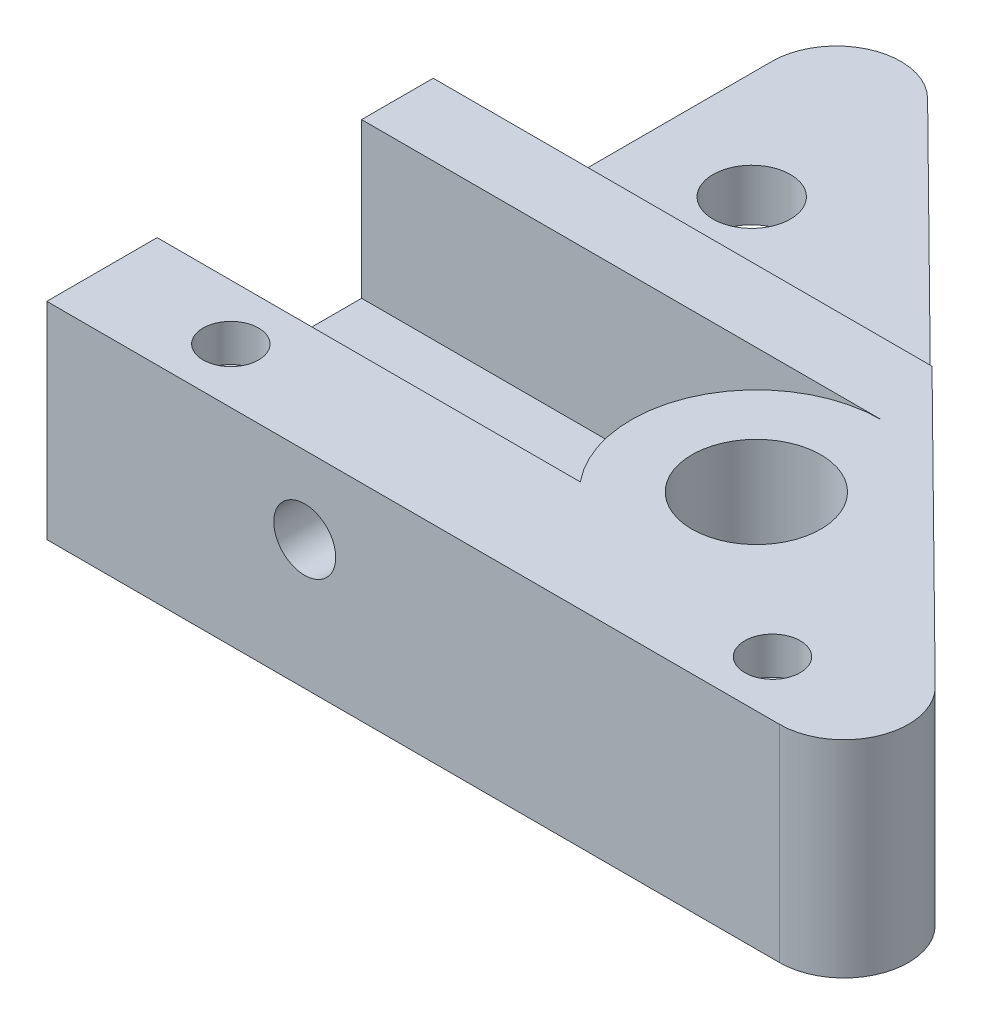
ISO-10303-21;
HEADER;
FILE_DESCRIPTION(('STEP AP214'),'2;1');
FILE_NAME('part.step','',(''),(''),'','','');
FILE_SCHEMA(('AUTOMOTIVE_DESIGN { 1 0 10303 214 1 1 1 1 }'));
ENDSEC;
DATA;
#1=APPLICATION_CONTEXT('core data for automotive mechanical design processes');
#2=APPLICATION_PROTOCOL_DEFINITION('international standard','automotive_design',2000,#1);
#3=PRODUCT_CONTEXT('',#1,'mechanical');
#4=PRODUCT('Part','Part','',(#3));
#5=PRODUCT_RELATED_PRODUCT_CATEGORY('part','',(#4));
#6=PRODUCT_DEFINITION_FORMATION('','',#4);
#7=PRODUCT_DEFINITION_CONTEXT('part definition',#1,'design');
#8=PRODUCT_DEFINITION('design','',#6,#7);
#9=PRODUCT_DEFINITION_SHAPE('','',#8);
#10=(LENGTH_UNIT() NAMED_UNIT(*) SI_UNIT(.MILLI.,.METRE.));
#11=(NAMED_UNIT(*) PLANE_ANGLE_UNIT() SI_UNIT($,.RADIAN.));
#12=(NAMED_UNIT(*) SI_UNIT($,.STERADIAN.) SOLID_ANGLE_UNIT());
#13=UNCERTAINTY_MEASURE_WITH_UNIT(LENGTH_MEASURE(1.E-05),#10,'distance_accuracy_value','');
#14=(GEOMETRIC_REPRESENTATION_CONTEXT(3) GLOBAL_UNCERTAINTY_ASSIGNED_CONTEXT((#13)) GLOBAL_UNIT_ASSIGNED_CONTEXT((#10,
#11,#12)) REPRESENTATION_CONTEXT('',''));
#15=CARTESIAN_POINT('',(0.,0.,0.));
#16=DIRECTION('',(0.,0.,1.));
#17=DIRECTION('',(1.,0.,0.));
#18=AXIS2_PLACEMENT_3D('',#15,#16,#17);
#19=CARTESIAN_POINT('',(0.,4.,0.));
#20=DIRECTION('',(0.,-1.,0.));
#21=DIRECTION('',(0.,0.,-1.));
#22=AXIS2_PLACEMENT_3D('',#19,#20,#21);
#23=PLANE('',#22);
#24=CARTESIAN_POINT('',(2.5213865198942,4.,-36.4963794963007));
#25=DIRECTION('',(0.,1.,0.));
#26=DIRECTION('',(0.,0.,1.));
#27=AXIS2_PLACEMENT_3D('',#24,#25,#26);
#28=CIRCLE('',#27,3.);
#29=CARTESIAN_POINT('',(2.5213865198942,4.,-33.4963794963007));
#30=VERTEX_POINT('',#29);
#31=EDGE_CURVE('E148',#30,#30,#28,.T.);
#32=ORIENTED_EDGE('',*,*,#31,.F.);
#33=EDGE_LOOP('',(#32));
#34=FACE_BOUND('',#33,.T.);
#35=DIRECTION('',(0.,0.,1.));
#36=VECTOR('',#35,1.);
#37=CARTESIAN_POINT('',(-5.79032676316651,4.,-58.3473631167096));
#38=LINE('',#37,#36);
#39=CARTESIAN_POINT('',(-5.79032676316651,4.,-46.3731764406958));
#40=VERTEX_POINT('',#39);
#41=CARTESIAN_POINT('',(-5.79032676316651,4.,-20.1091888870764));
#42=VERTEX_POINT('',#41);
#43=EDGE_CURVE('E158',#40,#42,#38,.T.);
#44=ORIENTED_EDGE('',*,*,#43,.T.);
#45=DIRECTION('',(1.,0.,0.));
#46=VECTOR('',#45,1.);
#47=CARTESIAN_POINT('',(0.,4.,-20.1091888870764));
#48=LINE('',#47,#46);
#49=CARTESIAN_POINT('',(32.8873723225019,4.,-20.1091888870764));
#50=VERTEX_POINT('',#49);
#51=EDGE_CURVE('E233',#42,#50,#48,.T.);
#52=ORIENTED_EDGE('',*,*,#51,.T.);
#53=DIRECTION('',(-0.711135832081653,0.,-0.703054641069622));
#54=VECTOR('',#53,1.);
#55=CARTESIAN_POINT('',(-5.79032676316651,4.,-58.3473631167096));
#56=LINE('',#55,#54);
#57=CARTESIAN_POINT('',(2.7249464421816,4.,-49.928855601104));
#58=VERTEX_POINT('',#57);
#59=EDGE_CURVE('E154',#50,#58,#56,.T.);
#60=ORIENTED_EDGE('',*,*,#59,.T.);
#61=CARTESIAN_POINT('',(-0.790326763166514,4.,-46.3731764406958));
#62=DIRECTION('',(0.,-1.,0.));
#63=DIRECTION('',(0.,0.,-1.));
#64=AXIS2_PLACEMENT_3D('',#61,#62,#63);
#65=CIRCLE('',#64,5.);
#66=EDGE_CURVE('E44',#58,#40,#65,.F.);
#67=ORIENTED_EDGE('',*,*,#66,.T.);
#68=EDGE_LOOP('',(#44,#52,#60,#67));
#69=FACE_BOUND('',#68,.T.);
#70=ADVANCED_FACE('F36',(#34,#69),#23,.F.);
#71=CARTESIAN_POINT('',(34.5199864892679,4.,-4.85637949630069));
#72=DIRECTION('',(0.,1.,0.));
#73=DIRECTION('',(0.,0.,1.));
#74=AXIS2_PLACEMENT_3D('',#71,#72,#73);
#75=CIRCLE('',#74,9.69900233067128);
#76=CARTESIAN_POINT('',(34.5199864892679,4.,-14.555381826972));
#77=VERTEX_POINT('',#76);
#78=CARTESIAN_POINT('',(27.0224363559879,4.,1.29645628968623));
#79=VERTEX_POINT('',#78);
#80=EDGE_CURVE('E51',#77,#79,#75,.T.);
#81=ORIENTED_EDGE('',*,*,#80,.F.);
#82=DIRECTION('',(-1.,0.,0.));
#83=VECTOR('',#82,1.);
#84=CARTESIAN_POINT('',(0.,4.,-14.555381826972));
#85=LINE('',#84,#83);
#86=CARTESIAN_POINT('',(-5.79032676316651,4.,-14.555381826972));
#87=VERTEX_POINT('',#86);
#88=EDGE_CURVE('E136',#77,#87,#85,.T.);
#89=ORIENTED_EDGE('',*,*,#88,.T.);
#90=CARTESIAN_POINT('',(-5.79032676316651,4.,1.29645628968623));
#91=VERTEX_POINT('',#90);
#92=EDGE_CURVE('E156',#87,#91,#38,.T.);
#93=ORIENTED_EDGE('',*,*,#92,.T.);
#94=DIRECTION('',(-1.,0.,0.));
#95=VECTOR('',#94,1.);
#96=CARTESIAN_POINT('',(0.,4.,1.29645628968623));
#97=LINE('',#96,#95);
#98=EDGE_CURVE('E56',#79,#91,#97,.T.);
#99=ORIENTED_EDGE('',*,*,#98,.F.);
#100=EDGE_LOOP('',(#81,#89,#93,#99));
#101=FACE_BOUND('',#100,.T.);
#102=ADVANCED_FACE('F248',(#101),#23,.F.);
#103=CARTESIAN_POINT('',(0.,0.,0.));
#104=DIRECTION('',(0.,-1.,0.));
#105=DIRECTION('',(0.,0.,-1.));
#106=AXIS2_PLACEMENT_3D('',#103,#104,#105);
#107=PLANE('',#106);
#108=CARTESIAN_POINT('',(2.5213865198942,0.,-36.4963794963007));
#109=DIRECTION('',(0.,1.,0.));
#110=DIRECTION('',(0.,0.,1.));
#111=AXIS2_PLACEMENT_3D('',#108,#109,#110);
#112=CIRCLE('',#111,3.);
#113=CARTESIAN_POINT('',(2.5213865198942,0.,-33.4963794963007));
#114=VERTEX_POINT('',#113);
#115=EDGE_CURVE('E142',#114,#114,#112,.T.);
#116=ORIENTED_EDGE('',*,*,#115,.T.);
#117=EDGE_LOOP('',(#116));
#118=FACE_BOUND('',#117,.T.);
#119=DIRECTION('',(0.,0.,1.));
#120=VECTOR('',#119,1.);
#121=CARTESIAN_POINT('',(-5.79032676316651,0.,-58.3473631167096));
#122=LINE('',#121,#120);
#123=CARTESIAN_POINT('',(-5.79032676316651,0.,-46.3731764406958));
#124=VERTEX_POINT('',#123);
#125=CARTESIAN_POINT('',(-5.79032676316651,0.,9.85213545009449));
#126=VERTEX_POINT('',#125);
#127=EDGE_CURVE('E163',#124,#126,#122,.T.);
#128=ORIENTED_EDGE('',*,*,#127,.F.);
#129=CARTESIAN_POINT('',(-0.790326763166514,0.,-46.3731764406958));
#130=DIRECTION('',(0.,-1.,0.));
#131=DIRECTION('',(0.,0.,-1.));
#132=AXIS2_PLACEMENT_3D('',#129,#130,#131);
#133=CIRCLE('',#132,5.);
#134=CARTESIAN_POINT('',(2.7249464421816,0.,-49.928855601104));
#135=VERTEX_POINT('',#134);
#136=EDGE_CURVE('E174',#124,#135,#133,.T.);
#137=ORIENTED_EDGE('',*,*,#136,.T.);
#138=DIRECTION('',(-0.711135832081653,0.,-0.703054641069622));
#139=VECTOR('',#138,1.);
#140=CARTESIAN_POINT('',(-5.79032676316651,0.,-58.3473631167096));
#141=LINE('',#140,#139);
#142=CARTESIAN_POINT('',(54.5390625394423,0.,1.29645628968623));
#143=VERTEX_POINT('',#142);
#144=EDGE_CURVE('E151',#143,#135,#141,.T.);
#145=ORIENTED_EDGE('',*,*,#144,.F.);
#146=CARTESIAN_POINT('',(51.0237893340942,0.,4.8521354500945));
#147=DIRECTION('',(0.,-1.,0.));
#148=DIRECTION('',(0.,0.,-1.));
#149=AXIS2_PLACEMENT_3D('',#146,#147,#148);
#150=CIRCLE('',#149,5.);
#151=CARTESIAN_POINT('',(51.0237893340942,0.,9.85213545009449));
#152=VERTEX_POINT('',#151);
#153=EDGE_CURVE('E172',#143,#152,#150,.T.);
#154=ORIENTED_EDGE('',*,*,#153,.T.);
#155=DIRECTION('',(1.,0.,0.));
#156=VECTOR('',#155,1.);
#157=CARTESIAN_POINT('',(-5.79032676316651,0.,9.85213545009449));
#158=LINE('',#157,#156);
#159=EDGE_CURVE('E157',#126,#152,#158,.T.);
#160=ORIENTED_EDGE('',*,*,#159,.F.);
#161=EDGE_LOOP('',(#128,#137,#145,#154,#160));
#162=FACE_BOUND('',#161,.T.);
#163=CARTESIAN_POINT('',(34.5199864892679,0.,-4.85637949630069));
#164=DIRECTION('',(0.,1.,0.));
#165=DIRECTION('',(0.,0.,1.));
#166=AXIS2_PLACEMENT_3D('',#163,#164,#165);
#167=CIRCLE('',#166,5.);
#168=CARTESIAN_POINT('',(34.5199864892679,0.,0.143620503699315));
#169=VERTEX_POINT('',#168);
#170=EDGE_CURVE('E139',#169,#169,#167,.T.);
#171=ORIENTED_EDGE('',*,*,#170,.T.);
#172=EDGE_LOOP('',(#171));
#173=FACE_BOUND('',#172,.T.);
#174=ADVANCED_FACE('F198',(#118,#162,#173),#107,.T.);
#175=CARTESIAN_POINT('',(-5.79032676316651,4.,-58.3473631167096));
#176=DIRECTION('',(-0.703054641069622,0.,0.711135832081653));
#177=DIRECTION('',(0.711135832081653,0.,0.703054641069622));
#178=AXIS2_PLACEMENT_3D('',#175,#176,#177);
#179=PLANE('',#178);
#180=ORIENTED_EDGE('',*,*,#144,.T.);
#181=DIRECTION('',(0.,-1.,0.));
#182=VECTOR('',#181,1.);
#183=CARTESIAN_POINT('',(2.7249464421816,4.,-49.928855601104));
#184=LINE('',#183,#182);
#185=EDGE_CURVE('E179',#135,#58,#184,.F.);
#186=ORIENTED_EDGE('',*,*,#185,.T.);
#187=ORIENTED_EDGE('',*,*,#59,.F.);
#188=DIRECTION('',(0.,-1.,0.));
#189=VECTOR('',#188,1.);
#190=CARTESIAN_POINT('',(32.8873723225019,16.,-20.1091888870764));
#191=LINE('',#190,#189);
#192=CARTESIAN_POINT('',(32.8873723225019,16.,-20.1091888870764));
#193=VERTEX_POINT('',#192);
#194=EDGE_CURVE('E144',#193,#50,#191,.T.);
#195=ORIENTED_EDGE('',*,*,#194,.F.);
#196=DIRECTION('',(-0.711135832081653,0.,-0.703054641069622));
#197=VECTOR('',#196,1.);
#198=CARTESIAN_POINT('',(26.3096998917406,16.,-26.6121140966606));
#199=LINE('',#198,#197);
#200=CARTESIAN_POINT('',(54.5390625394423,16.,1.29645628968623));
#201=VERTEX_POINT('',#200);
#202=EDGE_CURVE('E205',#201,#193,#199,.T.);
#203=ORIENTED_EDGE('',*,*,#202,.F.);
#204=DIRECTION('',(0.,-1.,0.));
#205=VECTOR('',#204,1.);
#206=CARTESIAN_POINT('',(54.5390625394423,4.,1.29645628968623));
#207=LINE('',#206,#205);
#208=EDGE_CURVE('E176',#201,#143,#207,.T.);
#209=ORIENTED_EDGE('',*,*,#208,.T.);
#210=EDGE_LOOP('',(#180,#186,#187,#195,#203,#209));
#211=FACE_BOUND('',#210,.T.);
#212=ADVANCED_FACE('F202',(#211),#179,.F.);
#213=CARTESIAN_POINT('',(-5.79032676316651,4.,-58.3473631167096));
#214=DIRECTION('',(1.,0.,0.));
#215=DIRECTION('',(0.,0.,-1.));
#216=AXIS2_PLACEMENT_3D('',#213,#214,#215);
#217=PLANE('',#216);
#218=ORIENTED_EDGE('',*,*,#43,.F.);
#219=DIRECTION('',(0.,-1.,0.));
#220=VECTOR('',#219,1.);
#221=CARTESIAN_POINT('',(-5.79032676316651,4.,-46.3731764406958));
#222=LINE('',#221,#220);
#223=EDGE_CURVE('E169',#40,#124,#222,.T.);
#224=ORIENTED_EDGE('',*,*,#223,.T.);
#225=ORIENTED_EDGE('',*,*,#127,.T.);
#226=DIRECTION('',(0.,-1.,0.));
#227=VECTOR('',#226,1.);
#228=CARTESIAN_POINT('',(-5.79032676316651,4.,9.85213545009449));
#229=LINE('',#228,#227);
#230=CARTESIAN_POINT('',(-5.79032676316651,16.,9.85213545009449));
#231=VERTEX_POINT('',#230);
#232=EDGE_CURVE('E160',#231,#126,#229,.T.);
#233=ORIENTED_EDGE('',*,*,#232,.F.);
#234=DIRECTION('',(0.,0.,1.));
#235=VECTOR('',#234,1.);
#236=CARTESIAN_POINT('',(-5.79032676316651,16.,0.));
#237=LINE('',#236,#235);
#238=CARTESIAN_POINT('',(-5.79032676316651,16.,1.29645628968623));
#239=VERTEX_POINT('',#238);
#240=EDGE_CURVE('E126',#239,#231,#237,.T.);
#241=ORIENTED_EDGE('',*,*,#240,.F.);
#242=DIRECTION('',(0.,-1.,0.));
#243=VECTOR('',#242,1.);
#244=CARTESIAN_POINT('',(-5.79032676316651,16.,1.29645628968623));
#245=LINE('',#244,#243);
#246=EDGE_CURVE('E122',#239,#91,#245,.T.);
#247=ORIENTED_EDGE('',*,*,#246,.T.);
#248=ORIENTED_EDGE('',*,*,#92,.F.);
#249=DIRECTION('',(0.,-1.,0.));
#250=VECTOR('',#249,1.);
#251=CARTESIAN_POINT('',(-5.79032676316651,16.,-14.555381826972));
#252=LINE('',#251,#250);
#253=CARTESIAN_POINT('',(-5.79032676316651,16.,-14.555381826972));
#254=VERTEX_POINT('',#253);
#255=EDGE_CURVE('E237',#254,#87,#252,.T.);
#256=ORIENTED_EDGE('',*,*,#255,.F.);
#257=DIRECTION('',(0.,0.,1.));
#258=VECTOR('',#257,1.);
#259=CARTESIAN_POINT('',(-5.79032676316651,16.,0.));
#260=LINE('',#259,#258);
#261=CARTESIAN_POINT('',(-5.79032676316651,16.,-20.1091888870764));
#262=VERTEX_POINT('',#261);
#263=EDGE_CURVE('E223',#262,#254,#260,.T.);
#264=ORIENTED_EDGE('',*,*,#263,.F.);
#265=DIRECTION('',(0.,-1.,0.));
#266=VECTOR('',#265,1.);
#267=CARTESIAN_POINT('',(-5.79032676316651,16.,-20.1091888870764));
#268=LINE('',#267,#266);
#269=EDGE_CURVE('E193',#262,#42,#268,.T.);
#270=ORIENTED_EDGE('',*,*,#269,.T.);
#271=EDGE_LOOP('',(#218,#224,#225,#233,#241,#247,#248,#256,#264,#270));
#272=FACE_BOUND('',#271,.T.);
#273=ADVANCED_FACE('F190',(#272),#217,.F.);
#274=CARTESIAN_POINT('',(-5.79032676316651,4.,9.85213545009449));
#275=DIRECTION('',(0.,0.,-1.));
#276=DIRECTION('',(-1.,0.,0.));
#277=AXIS2_PLACEMENT_3D('',#274,#275,#276);
#278=PLANE('',#277);
#279=CARTESIAN_POINT('',(14.2096732368335,10.,9.85213545009449));
#280=DIRECTION('',(0.,0.,-1.));
#281=DIRECTION('',(-1.,0.,0.));
#282=AXIS2_PLACEMENT_3D('',#279,#280,#281);
#283=CIRCLE('',#282,2.40187164140282);
#284=CARTESIAN_POINT('',(11.8078015954307,10.,9.85213545009449));
#285=VERTEX_POINT('',#284);
#286=EDGE_CURVE('E231',#285,#285,#283,.T.);
#287=ORIENTED_EDGE('',*,*,#286,.T.);
#288=EDGE_LOOP('',(#287));
#289=FACE_BOUND('',#288,.T.);
#290=ORIENTED_EDGE('',*,*,#159,.T.);
#291=DIRECTION('',(0.,-1.,0.));
#292=VECTOR('',#291,1.);
#293=CARTESIAN_POINT('',(51.0237893340942,4.,9.85213545009449));
#294=LINE('',#293,#292);
#295=CARTESIAN_POINT('',(51.0237893340942,16.,9.8521354500945));
#296=VERTEX_POINT('',#295);
#297=EDGE_CURVE('E11',#152,#296,#294,.F.);
#298=ORIENTED_EDGE('',*,*,#297,.T.);
#299=DIRECTION('',(1.,0.,0.));
#300=VECTOR('',#299,1.);
#301=CARTESIAN_POINT('',(0.,16.,9.85213545009449));
#302=LINE('',#301,#300);
#303=EDGE_CURVE('E214',#231,#296,#302,.T.);
#304=ORIENTED_EDGE('',*,*,#303,.F.);
#305=ORIENTED_EDGE('',*,*,#232,.T.);
#306=EDGE_LOOP('',(#290,#298,#304,#305));
#307=FACE_BOUND('',#306,.T.);
#308=ADVANCED_FACE('F310',(#289,#307),#278,.F.);
#309=CARTESIAN_POINT('',(2.5213865198942,4.,-36.4963794963007));
#310=DIRECTION('',(0.,-1.,0.));
#311=DIRECTION('',(0.,0.,-1.));
#312=AXIS2_PLACEMENT_3D('',#309,#310,#311);
#313=CYLINDRICAL_SURFACE('',#312,3.);
#314=ORIENTED_EDGE('',*,*,#31,.T.);
#315=EDGE_LOOP('',(#314));
#316=FACE_BOUND('',#315,.T.);
#317=ORIENTED_EDGE('',*,*,#115,.F.);
#318=EDGE_LOOP('',(#317));
#319=FACE_BOUND('',#318,.T.);
#320=ADVANCED_FACE('F305',(#316,#319),#313,.F.);
#321=CARTESIAN_POINT('',(34.5199864892679,4.,-4.85637949630069));
#322=DIRECTION('',(0.,-1.,0.));
#323=DIRECTION('',(0.,0.,-1.));
#324=AXIS2_PLACEMENT_3D('',#321,#322,#323);
#325=CYLINDRICAL_SURFACE('',#324,5.);
#326=ORIENTED_EDGE('',*,*,#170,.F.);
#327=EDGE_LOOP('',(#326));
#328=FACE_BOUND('',#327,.T.);
#329=CARTESIAN_POINT('',(34.5199864892679,16.,-4.85637949630069));
#330=DIRECTION('',(0.,1.,0.));
#331=DIRECTION('',(0.,0.,1.));
#332=AXIS2_PLACEMENT_3D('',#329,#330,#331);
#333=CIRCLE('',#332,5.);
#334=CARTESIAN_POINT('',(34.5199864892679,16.,0.143620503699315));
#335=VERTEX_POINT('',#334);
#336=EDGE_CURVE('E226',#335,#335,#333,.F.);
#337=ORIENTED_EDGE('',*,*,#336,.F.);
#338=EDGE_LOOP('',(#337));
#339=FACE_BOUND('',#338,.T.);
#340=ADVANCED_FACE('F318',(#328,#339),#325,.F.);
#341=CARTESIAN_POINT('',(-0.790326763166514,4.,-46.3731764406958));
#342=DIRECTION('',(0.,-1.,0.));
#343=DIRECTION('',(0.,0.,-1.));
#344=AXIS2_PLACEMENT_3D('',#341,#342,#343);
#345=CYLINDRICAL_SURFACE('',#344,5.);
#346=ORIENTED_EDGE('',*,*,#66,.F.);
#347=ORIENTED_EDGE('',*,*,#185,.F.);
#348=ORIENTED_EDGE('',*,*,#136,.F.);
#349=ORIENTED_EDGE('',*,*,#223,.F.);
#350=EDGE_LOOP('',(#346,#347,#348,#349));
#351=FACE_BOUND('',#350,.T.);
#352=ADVANCED_FACE('F195',(#351),#345,.T.);
#353=CARTESIAN_POINT('',(51.0237893340942,4.,4.8521354500945));
#354=DIRECTION('',(0.,-1.,0.));
#355=DIRECTION('',(0.,0.,-1.));
#356=AXIS2_PLACEMENT_3D('',#353,#354,#355);
#357=CYLINDRICAL_SURFACE('',#356,5.);
#358=ORIENTED_EDGE('',*,*,#208,.F.);
#359=CARTESIAN_POINT('',(51.0237893340942,16.,4.8521354500945));
#360=DIRECTION('',(0.,1.,0.));
#361=DIRECTION('',(0.,0.,1.));
#362=AXIS2_PLACEMENT_3D('',#359,#360,#361);
#363=CIRCLE('',#362,5.);
#364=EDGE_CURVE('E210',#296,#201,#363,.T.);
#365=ORIENTED_EDGE('',*,*,#364,.F.);
#366=ORIENTED_EDGE('',*,*,#297,.F.);
#367=ORIENTED_EDGE('',*,*,#153,.F.);
#368=EDGE_LOOP('',(#358,#365,#366,#367));
#369=FACE_BOUND('',#368,.T.);
#370=ADVANCED_FACE('F38',(#369),#357,.T.);
#371=CARTESIAN_POINT('',(34.5199864892679,16.,-4.85637949630069));
#372=DIRECTION('',(0.,-1.,0.));
#373=DIRECTION('',(0.,0.,-1.));
#374=AXIS2_PLACEMENT_3D('',#371,#372,#373);
#375=CYLINDRICAL_SURFACE('',#374,9.69900233067128);
#376=ORIENTED_EDGE('',*,*,#80,.T.);
#377=DIRECTION('',(0.,-1.,0.));
#378=VECTOR('',#377,1.);
#379=CARTESIAN_POINT('',(27.0224363559879,16.,1.29645628968623));
#380=LINE('',#379,#378);
#381=CARTESIAN_POINT('',(27.0224363559879,16.,1.29645628968623));
#382=VERTEX_POINT('',#381);
#383=EDGE_CURVE('E120',#382,#79,#380,.T.);
#384=ORIENTED_EDGE('',*,*,#383,.F.);
#385=CARTESIAN_POINT('',(34.5199864892679,16.,-4.85637949630069));
#386=DIRECTION('',(0.,1.,0.));
#387=DIRECTION('',(0.,0.,1.));
#388=AXIS2_PLACEMENT_3D('',#385,#386,#387);
#389=CIRCLE('',#388,9.69900233067128);
#390=CARTESIAN_POINT('',(34.5199864892679,16.,-14.555381826972));
#391=VERTEX_POINT('',#390);
#392=EDGE_CURVE('E127',#391,#382,#389,.T.);
#393=ORIENTED_EDGE('',*,*,#392,.F.);
#394=DIRECTION('',(0.,-1.,0.));
#395=VECTOR('',#394,1.);
#396=CARTESIAN_POINT('',(34.5199864892679,16.,-14.555381826972));
#397=LINE('',#396,#395);
#398=EDGE_CURVE('E229',#391,#77,#397,.T.);
#399=ORIENTED_EDGE('',*,*,#398,.T.);
#400=EDGE_LOOP('',(#376,#384,#393,#399));
#401=FACE_BOUND('',#400,.T.);
#402=ADVANCED_FACE('F138',(#401),#375,.T.);
#403=CARTESIAN_POINT('',(0.,16.,1.29645628968623));
#404=DIRECTION('',(0.,0.,1.));
#405=DIRECTION('',(1.,0.,0.));
#406=AXIS2_PLACEMENT_3D('',#403,#404,#405);
#407=PLANE('',#406);
#408=CARTESIAN_POINT('',(14.2096732368335,10.,1.29645628968623));
#409=DIRECTION('',(0.,0.,-1.));
#410=DIRECTION('',(-1.,0.,0.));
#411=AXIS2_PLACEMENT_3D('',#408,#409,#410);
#412=CIRCLE('',#411,2.40187164140282);
#413=CARTESIAN_POINT('',(11.8078015954307,10.,1.29645628968623));
#414=VERTEX_POINT('',#413);
#415=EDGE_CURVE('E252',#414,#414,#412,.T.);
#416=ORIENTED_EDGE('',*,*,#415,.F.);
#417=EDGE_LOOP('',(#416));
#418=FACE_BOUND('',#417,.T.);
#419=ORIENTED_EDGE('',*,*,#98,.T.);
#420=ORIENTED_EDGE('',*,*,#246,.F.);
#421=DIRECTION('',(-1.,0.,0.));
#422=VECTOR('',#421,1.);
#423=CARTESIAN_POINT('',(0.,16.,1.29645628968623));
#424=LINE('',#423,#422);
#425=EDGE_CURVE('E116',#382,#239,#424,.T.);
#426=ORIENTED_EDGE('',*,*,#425,.F.);
#427=ORIENTED_EDGE('',*,*,#383,.T.);
#428=EDGE_LOOP('',(#419,#420,#426,#427));
#429=FACE_BOUND('',#428,.T.);
#430=ADVANCED_FACE('F118',(#418,#429),#407,.F.);
#431=CARTESIAN_POINT('',(0.,16.,-20.1091888870764));
#432=DIRECTION('',(0.,0.,-1.));
#433=DIRECTION('',(-1.,0.,0.));
#434=AXIS2_PLACEMENT_3D('',#431,#432,#433);
#435=PLANE('',#434);
#436=ORIENTED_EDGE('',*,*,#51,.F.);
#437=ORIENTED_EDGE('',*,*,#269,.F.);
#438=DIRECTION('',(1.,0.,0.));
#439=VECTOR('',#438,1.);
#440=CARTESIAN_POINT('',(0.,16.,-20.1091888870764));
#441=LINE('',#440,#439);
#442=EDGE_CURVE('E216',#262,#193,#441,.T.);
#443=ORIENTED_EDGE('',*,*,#442,.T.);
#444=ORIENTED_EDGE('',*,*,#194,.T.);
#445=EDGE_LOOP('',(#436,#437,#443,#444));
#446=FACE_BOUND('',#445,.T.);
#447=ADVANCED_FACE('F242',(#446),#435,.T.);
#448=CARTESIAN_POINT('',(0.,16.,-14.555381826972));
#449=DIRECTION('',(0.,0.,1.));
#450=DIRECTION('',(1.,0.,0.));
#451=AXIS2_PLACEMENT_3D('',#448,#449,#450);
#452=PLANE('',#451);
#453=ORIENTED_EDGE('',*,*,#88,.F.);
#454=ORIENTED_EDGE('',*,*,#398,.F.);
#455=DIRECTION('',(-1.,0.,0.));
#456=VECTOR('',#455,1.);
#457=CARTESIAN_POINT('',(0.,16.,-14.555381826972));
#458=LINE('',#457,#456);
#459=EDGE_CURVE('E134',#391,#254,#458,.T.);
#460=ORIENTED_EDGE('',*,*,#459,.T.);
#461=ORIENTED_EDGE('',*,*,#255,.T.);
#462=EDGE_LOOP('',(#453,#454,#460,#461));
#463=FACE_BOUND('',#462,.T.);
#464=ADVANCED_FACE('F247',(#463),#452,.T.);
#465=CARTESIAN_POINT('',(0.,16.,0.));
#466=DIRECTION('',(0.,1.,0.));
#467=DIRECTION('',(0.,0.,1.));
#468=AXIS2_PLACEMENT_3D('',#465,#466,#467);
#469=PLANE('',#468);
#470=CARTESIAN_POINT('',(4.20967323683349,16.,5.5821354500945));
#471=DIRECTION('',(0.,1.,0.));
#472=DIRECTION('',(0.,0.,1.));
#473=AXIS2_PLACEMENT_3D('',#470,#471,#472);
#474=CIRCLE('',#473,2.15);
#475=CARTESIAN_POINT('',(4.20967323683349,16.,7.73213545009449));
#476=VERTEX_POINT('',#475);
#477=EDGE_CURVE('E262',#476,#476,#474,.T.);
#478=ORIENTED_EDGE('',*,*,#477,.F.);
#479=EDGE_LOOP('',(#478));
#480=FACE_BOUND('',#479,.T.);
#481=CARTESIAN_POINT('',(46.2096732368335,16.,5.5821354500945));
#482=DIRECTION('',(0.,1.,0.));
#483=DIRECTION('',(0.,0.,1.));
#484=AXIS2_PLACEMENT_3D('',#481,#482,#483);
#485=CIRCLE('',#484,2.15);
#486=CARTESIAN_POINT('',(46.2096732368335,16.,7.7321354500945));
#487=VERTEX_POINT('',#486);
#488=EDGE_CURVE('E256',#487,#487,#485,.T.);
#489=ORIENTED_EDGE('',*,*,#488,.F.);
#490=EDGE_LOOP('',(#489));
#491=FACE_BOUND('',#490,.T.);
#492=ORIENTED_EDGE('',*,*,#392,.T.);
#493=ORIENTED_EDGE('',*,*,#425,.T.);
#494=ORIENTED_EDGE('',*,*,#240,.T.);
#495=ORIENTED_EDGE('',*,*,#303,.T.);
#496=ORIENTED_EDGE('',*,*,#364,.T.);
#497=ORIENTED_EDGE('',*,*,#202,.T.);
#498=ORIENTED_EDGE('',*,*,#442,.F.);
#499=ORIENTED_EDGE('',*,*,#263,.T.);
#500=ORIENTED_EDGE('',*,*,#459,.F.);
#501=EDGE_LOOP('',(#492,#493,#494,#495,#496,#497,#498,#499,#500));
#502=FACE_BOUND('',#501,.T.);
#503=ORIENTED_EDGE('',*,*,#336,.T.);
#504=EDGE_LOOP('',(#503));
#505=FACE_BOUND('',#504,.T.);
#506=ADVANCED_FACE('F131',(#480,#491,#502,#505),#469,.T.);
#507=CARTESIAN_POINT('',(14.2096732368335,10.,31.2964562896862));
#508=DIRECTION('',(0.,0.,-1.));
#509=DIRECTION('',(-1.,0.,0.));
#510=AXIS2_PLACEMENT_3D('',#507,#508,#509);
#511=CYLINDRICAL_SURFACE('',#510,2.40187164140282);
#512=ORIENTED_EDGE('',*,*,#415,.T.);
#513=EDGE_LOOP('',(#512));
#514=FACE_BOUND('',#513,.T.);
#515=ORIENTED_EDGE('',*,*,#286,.F.);
#516=EDGE_LOOP('',(#515));
#517=FACE_BOUND('',#516,.T.);
#518=ADVANCED_FACE('F279',(#514,#517),#511,.F.);
#519=CARTESIAN_POINT('',(46.2096732368335,13.1,5.5821354500945));
#520=DIRECTION('',(0.,1.,0.));
#521=DIRECTION('',(0.,0.,1.));
#522=AXIS2_PLACEMENT_3D('',#519,#520,#521);
#523=CYLINDRICAL_SURFACE('',#522,2.15);
#524=CARTESIAN_POINT('',(46.2096732368335,13.1,5.5821354500945));
#525=DIRECTION('',(0.,1.,0.));
#526=DIRECTION('',(0.,0.,1.));
#527=AXIS2_PLACEMENT_3D('',#524,#525,#526);
#528=CIRCLE('',#527,2.15);
#529=CARTESIAN_POINT('',(46.2096732368335,13.1,7.7321354500945));
#530=VERTEX_POINT('',#529);
#531=EDGE_CURVE('E255',#530,#530,#528,.T.);
#532=ORIENTED_EDGE('',*,*,#531,.F.);
#533=EDGE_LOOP('',(#532));
#534=FACE_BOUND('',#533,.T.);
#535=ORIENTED_EDGE('',*,*,#488,.T.);
#536=EDGE_LOOP('',(#535));
#537=FACE_BOUND('',#536,.T.);
#538=ADVANCED_FACE('F283',(#534,#537),#523,.F.);
#539=CARTESIAN_POINT('',(46.2096732368335,13.1,5.5821354500945));
#540=DIRECTION('',(0.,1.,0.));
#541=DIRECTION('',(0.,0.,1.));
#542=AXIS2_PLACEMENT_3D('',#539,#540,#541);
#543=PLANE('',#542);
#544=ORIENTED_EDGE('',*,*,#531,.T.);
#545=EDGE_LOOP('',(#544));
#546=FACE_BOUND('',#545,.T.);
#547=ADVANCED_FACE('F273',(#546),#543,.T.);
#548=CARTESIAN_POINT('',(4.20967323683349,13.1,5.5821354500945));
#549=DIRECTION('',(0.,1.,0.));
#550=DIRECTION('',(0.,0.,1.));
#551=AXIS2_PLACEMENT_3D('',#548,#549,#550);
#552=CYLINDRICAL_SURFACE('',#551,2.15);
#553=CARTESIAN_POINT('',(4.20967323683349,13.1,5.5821354500945));
#554=DIRECTION('',(0.,1.,0.));
#555=DIRECTION('',(0.,0.,1.));
#556=AXIS2_PLACEMENT_3D('',#553,#554,#555);
#557=CIRCLE('',#556,2.15);
#558=CARTESIAN_POINT('',(4.20967323683349,13.1,7.73213545009449));
#559=VERTEX_POINT('',#558);
#560=EDGE_CURVE('E259',#559,#559,#557,.T.);
#561=ORIENTED_EDGE('',*,*,#560,.F.);
#562=EDGE_LOOP('',(#561));
#563=FACE_BOUND('',#562,.T.);
#564=ORIENTED_EDGE('',*,*,#477,.T.);
#565=EDGE_LOOP('',(#564));
#566=FACE_BOUND('',#565,.T.);
#567=ADVANCED_FACE('F270',(#563,#566),#552,.F.);
#568=CARTESIAN_POINT('',(4.20967323683349,13.1,5.5821354500945));
#569=DIRECTION('',(0.,1.,0.));
#570=DIRECTION('',(0.,0.,1.));
#571=AXIS2_PLACEMENT_3D('',#568,#569,#570);
#572=PLANE('',#571);
#573=ORIENTED_EDGE('',*,*,#560,.T.);
#574=EDGE_LOOP('',(#573));
#575=FACE_BOUND('',#574,.T.);
#576=ADVANCED_FACE('F268',(#575),#572,.T.);
#577=CLOSED_SHELL('',(#70,#102,#174,#212,#273,#308,#320,#340,#352,#370,#402,#430,#447,#464,#506,
#518,#538,#547,#567,#576));
#578=MANIFOLD_SOLID_BREP('B2',#577);
#579=ADVANCED_BREP_SHAPE_REPRESENTATION('',(#18,#578),#14);
#580=SHAPE_DEFINITION_REPRESENTATION(#9,#579);
ENDSEC;
END-ISO-10303-21;
